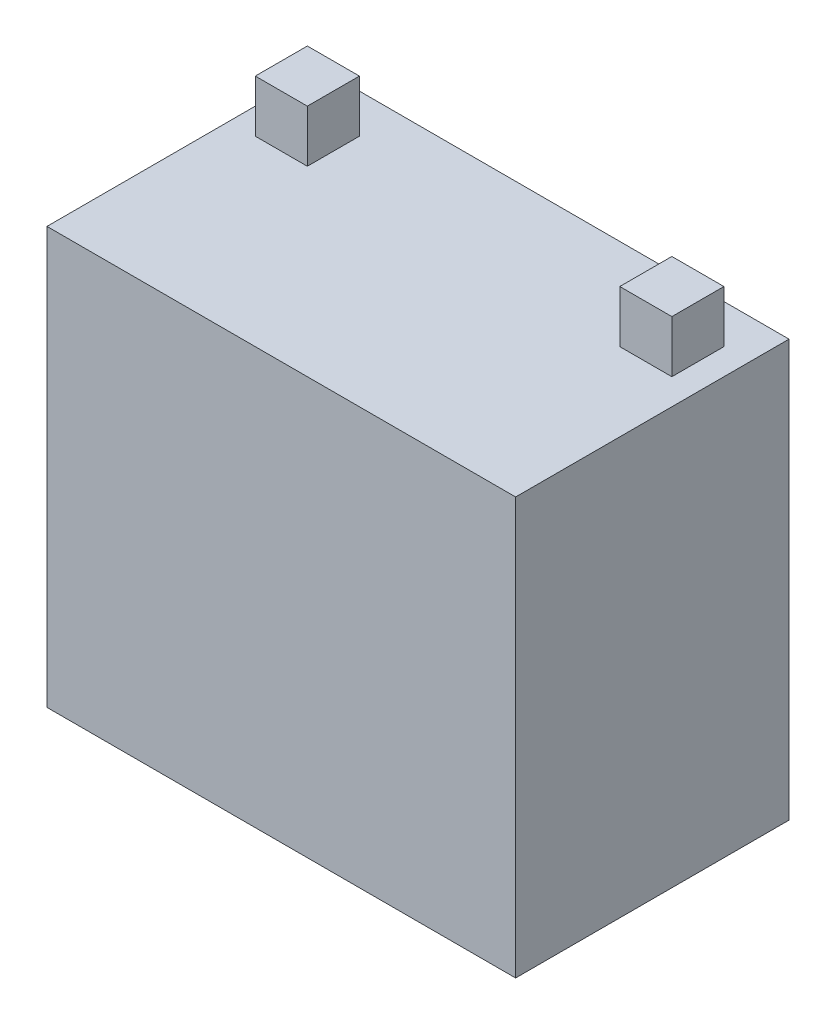
ISO-10303-21;
HEADER;
FILE_DESCRIPTION(('STEP AP214'),'2;1');
FILE_NAME('part.step','',(''),(''),'','','');
FILE_SCHEMA(('AUTOMOTIVE_DESIGN { 1 0 10303 214 1 1 1 1 }'));
ENDSEC;
DATA;
#1=APPLICATION_CONTEXT('core data for automotive mechanical design processes');
#2=APPLICATION_PROTOCOL_DEFINITION('international standard','automotive_design',2000,#1);
#3=PRODUCT_CONTEXT('',#1,'mechanical');
#4=PRODUCT('Part','Part','',(#3));
#5=PRODUCT_RELATED_PRODUCT_CATEGORY('part','',(#4));
#6=PRODUCT_DEFINITION_FORMATION('','',#4);
#7=PRODUCT_DEFINITION_CONTEXT('part definition',#1,'design');
#8=PRODUCT_DEFINITION('design','',#6,#7);
#9=PRODUCT_DEFINITION_SHAPE('','',#8);
#10=(LENGTH_UNIT() NAMED_UNIT(*) SI_UNIT(.MILLI.,.METRE.));
#11=(NAMED_UNIT(*) PLANE_ANGLE_UNIT() SI_UNIT($,.RADIAN.));
#12=(NAMED_UNIT(*) SI_UNIT($,.STERADIAN.) SOLID_ANGLE_UNIT());
#13=UNCERTAINTY_MEASURE_WITH_UNIT(LENGTH_MEASURE(1.E-05),#10,'distance_accuracy_value','');
#14=(GEOMETRIC_REPRESENTATION_CONTEXT(3) GLOBAL_UNCERTAINTY_ASSIGNED_CONTEXT((#13)) GLOBAL_UNIT_ASSIGNED_CONTEXT((#10,
#11,#12)) REPRESENTATION_CONTEXT('',''));
#15=CARTESIAN_POINT('',(0.,0.,0.));
#16=DIRECTION('',(0.,0.,1.));
#17=DIRECTION('',(1.,0.,0.));
#18=AXIS2_PLACEMENT_3D('',#15,#16,#17);
#19=CARTESIAN_POINT('',(0.,101.6,0.));
#20=DIRECTION('',(0.,-1.,0.));
#21=DIRECTION('',(0.,0.,-1.));
#22=AXIS2_PLACEMENT_3D('',#19,#20,#21);
#23=PLANE('',#22);
#24=DIRECTION('',(0.,0.,-1.));
#25=VECTOR('',#24,1.);
#26=CARTESIAN_POINT('',(-76.2,101.6,-47.625));
#27=LINE('',#26,#25);
#28=CARTESIAN_POINT('',(-76.2,101.6,-22.225));
#29=VERTEX_POINT('',#28);
#30=CARTESIAN_POINT('',(-76.2,101.6,-47.625));
#31=VERTEX_POINT('',#30);
#32=EDGE_CURVE('E145',#29,#31,#27,.T.);
#33=ORIENTED_EDGE('',*,*,#32,.F.);
#34=DIRECTION('',(1.,0.,0.));
#35=VECTOR('',#34,1.);
#36=CARTESIAN_POINT('',(-101.6,101.6,-22.225));
#37=LINE('',#36,#35);
#38=CARTESIAN_POINT('',(-101.6,101.6,-22.225));
#39=VERTEX_POINT('',#38);
#40=EDGE_CURVE('E158',#39,#29,#37,.T.);
#41=ORIENTED_EDGE('',*,*,#40,.F.);
#42=DIRECTION('',(0.,0.,1.));
#43=VECTOR('',#42,1.);
#44=CARTESIAN_POINT('',(-101.6,101.6,-47.625));
#45=LINE('',#44,#43);
#46=CARTESIAN_POINT('',(-101.6,101.6,-47.625));
#47=VERTEX_POINT('',#46);
#48=EDGE_CURVE('E167',#47,#39,#45,.T.);
#49=ORIENTED_EDGE('',*,*,#48,.F.);
#50=DIRECTION('',(-1.,0.,0.));
#51=VECTOR('',#50,1.);
#52=CARTESIAN_POINT('',(-101.6,101.6,-47.625));
#53=LINE('',#52,#51);
#54=EDGE_CURVE('E148',#31,#47,#53,.T.);
#55=ORIENTED_EDGE('',*,*,#54,.F.);
#56=EDGE_LOOP('',(#33,#41,#49,#55));
#57=FACE_BOUND('',#56,.T.);
#58=DIRECTION('',(0.,0.,-1.));
#59=VECTOR('',#58,1.);
#60=CARTESIAN_POINT('',(114.3,101.6,66.675));
#61=LINE('',#60,#59);
#62=CARTESIAN_POINT('',(114.3,101.6,66.675));
#63=VERTEX_POINT('',#62);
#64=CARTESIAN_POINT('',(114.3,101.6,-66.675));
#65=VERTEX_POINT('',#64);
#66=EDGE_CURVE('E184',#63,#65,#61,.T.);
#67=ORIENTED_EDGE('',*,*,#66,.T.);
#68=DIRECTION('',(-1.,0.,0.));
#69=VECTOR('',#68,1.);
#70=CARTESIAN_POINT('',(-114.3,101.6,-66.675));
#71=LINE('',#70,#69);
#72=CARTESIAN_POINT('',(-114.3,101.6,-66.675));
#73=VERTEX_POINT('',#72);
#74=EDGE_CURVE('E187',#65,#73,#71,.T.);
#75=ORIENTED_EDGE('',*,*,#74,.T.);
#76=DIRECTION('',(0.,0.,1.));
#77=VECTOR('',#76,1.);
#78=CARTESIAN_POINT('',(-114.3,101.6,66.675));
#79=LINE('',#78,#77);
#80=CARTESIAN_POINT('',(-114.3,101.6,66.675));
#81=VERTEX_POINT('',#80);
#82=EDGE_CURVE('E190',#73,#81,#79,.T.);
#83=ORIENTED_EDGE('',*,*,#82,.T.);
#84=DIRECTION('',(1.,0.,0.));
#85=VECTOR('',#84,1.);
#86=CARTESIAN_POINT('',(-114.3,101.6,66.675));
#87=LINE('',#86,#85);
#88=EDGE_CURVE('E192',#81,#63,#87,.T.);
#89=ORIENTED_EDGE('',*,*,#88,.T.);
#90=EDGE_LOOP('',(#67,#75,#83,#89));
#91=FACE_BOUND('',#90,.T.);
#92=DIRECTION('',(0.,0.,-1.));
#93=VECTOR('',#92,1.);
#94=CARTESIAN_POINT('',(101.6,101.6,-22.225));
#95=LINE('',#94,#93);
#96=CARTESIAN_POINT('',(101.6,101.6,-22.225));
#97=VERTEX_POINT('',#96);
#98=CARTESIAN_POINT('',(101.6,101.6,-47.625));
#99=VERTEX_POINT('',#98);
#100=EDGE_CURVE('E144',#97,#99,#95,.T.);
#101=ORIENTED_EDGE('',*,*,#100,.F.);
#102=DIRECTION('',(1.,0.,0.));
#103=VECTOR('',#102,1.);
#104=CARTESIAN_POINT('',(76.2,101.6,-22.225));
#105=LINE('',#104,#103);
#106=CARTESIAN_POINT('',(76.2,101.6,-22.225));
#107=VERTEX_POINT('',#106);
#108=EDGE_CURVE('E141',#107,#97,#105,.T.);
#109=ORIENTED_EDGE('',*,*,#108,.F.);
#110=DIRECTION('',(0.,0.,1.));
#111=VECTOR('',#110,1.);
#112=CARTESIAN_POINT('',(76.2,101.6,-22.225));
#113=LINE('',#112,#111);
#114=CARTESIAN_POINT('',(76.2,101.6,-47.625));
#115=VERTEX_POINT('',#114);
#116=EDGE_CURVE('E55',#115,#107,#113,.T.);
#117=ORIENTED_EDGE('',*,*,#116,.F.);
#118=DIRECTION('',(-1.,0.,0.));
#119=VECTOR('',#118,1.);
#120=CARTESIAN_POINT('',(76.2,101.6,-47.625));
#121=LINE('',#120,#119);
#122=EDGE_CURVE('E50',#99,#115,#121,.T.);
#123=ORIENTED_EDGE('',*,*,#122,.F.);
#124=EDGE_LOOP('',(#101,#109,#117,#123));
#125=FACE_BOUND('',#124,.T.);
#126=ADVANCED_FACE('F35',(#57,#91,#125),#23,.F.);
#127=CARTESIAN_POINT('',(114.3,101.6,66.675));
#128=DIRECTION('',(-1.,0.,0.));
#129=DIRECTION('',(0.,0.,1.));
#130=AXIS2_PLACEMENT_3D('',#127,#128,#129);
#131=PLANE('',#130);
#132=DIRECTION('',(0.,0.,-1.));
#133=VECTOR('',#132,1.);
#134=CARTESIAN_POINT('',(114.3,-101.6,66.675));
#135=LINE('',#134,#133);
#136=CARTESIAN_POINT('',(114.3,-101.6,66.675));
#137=VERTEX_POINT('',#136);
#138=CARTESIAN_POINT('',(114.3,-101.6,-66.675));
#139=VERTEX_POINT('',#138);
#140=EDGE_CURVE('E183',#137,#139,#135,.T.);
#141=ORIENTED_EDGE('',*,*,#140,.T.);
#142=DIRECTION('',(0.,-1.,0.));
#143=VECTOR('',#142,1.);
#144=CARTESIAN_POINT('',(114.3,101.6,-66.675));
#145=LINE('',#144,#143);
#146=EDGE_CURVE('E11',#65,#139,#145,.T.);
#147=ORIENTED_EDGE('',*,*,#146,.F.);
#148=ORIENTED_EDGE('',*,*,#66,.F.);
#149=DIRECTION('',(0.,-1.,0.));
#150=VECTOR('',#149,1.);
#151=CARTESIAN_POINT('',(114.3,101.6,66.675));
#152=LINE('',#151,#150);
#153=EDGE_CURVE('E194',#63,#137,#152,.T.);
#154=ORIENTED_EDGE('',*,*,#153,.T.);
#155=EDGE_LOOP('',(#141,#147,#148,#154));
#156=FACE_BOUND('',#155,.T.);
#157=ADVANCED_FACE('F37',(#156),#131,.F.);
#158=CARTESIAN_POINT('',(-114.3,101.6,-66.675));
#159=DIRECTION('',(0.,0.,1.));
#160=DIRECTION('',(1.,0.,0.));
#161=AXIS2_PLACEMENT_3D('',#158,#159,#160);
#162=PLANE('',#161);
#163=DIRECTION('',(-1.,0.,0.));
#164=VECTOR('',#163,1.);
#165=CARTESIAN_POINT('',(-114.3,-101.6,-66.675));
#166=LINE('',#165,#164);
#167=CARTESIAN_POINT('',(-114.3,-101.6,-66.675));
#168=VERTEX_POINT('',#167);
#169=EDGE_CURVE('E197',#139,#168,#166,.T.);
#170=ORIENTED_EDGE('',*,*,#169,.T.);
#171=DIRECTION('',(0.,-1.,0.));
#172=VECTOR('',#171,1.);
#173=CARTESIAN_POINT('',(-114.3,101.6,-66.675));
#174=LINE('',#173,#172);
#175=EDGE_CURVE('E43',#73,#168,#174,.T.);
#176=ORIENTED_EDGE('',*,*,#175,.F.);
#177=ORIENTED_EDGE('',*,*,#74,.F.);
#178=ORIENTED_EDGE('',*,*,#146,.T.);
#179=EDGE_LOOP('',(#170,#176,#177,#178));
#180=FACE_BOUND('',#179,.T.);
#181=ADVANCED_FACE('F226',(#180),#162,.F.);
#182=CARTESIAN_POINT('',(-114.3,101.6,66.675));
#183=DIRECTION('',(1.,0.,0.));
#184=DIRECTION('',(0.,0.,-1.));
#185=AXIS2_PLACEMENT_3D('',#182,#183,#184);
#186=PLANE('',#185);
#187=DIRECTION('',(0.,0.,1.));
#188=VECTOR('',#187,1.);
#189=CARTESIAN_POINT('',(-114.3,-101.6,66.675));
#190=LINE('',#189,#188);
#191=CARTESIAN_POINT('',(-114.3,-101.6,66.675));
#192=VERTEX_POINT('',#191);
#193=EDGE_CURVE('E199',#168,#192,#190,.T.);
#194=ORIENTED_EDGE('',*,*,#193,.T.);
#195=DIRECTION('',(0.,-1.,0.));
#196=VECTOR('',#195,1.);
#197=CARTESIAN_POINT('',(-114.3,101.6,66.675));
#198=LINE('',#197,#196);
#199=EDGE_CURVE('E204',#81,#192,#198,.T.);
#200=ORIENTED_EDGE('',*,*,#199,.F.);
#201=ORIENTED_EDGE('',*,*,#82,.F.);
#202=ORIENTED_EDGE('',*,*,#175,.T.);
#203=EDGE_LOOP('',(#194,#200,#201,#202));
#204=FACE_BOUND('',#203,.T.);
#205=ADVANCED_FACE('F211',(#204),#186,.F.);
#206=CARTESIAN_POINT('',(-114.3,101.6,66.675));
#207=DIRECTION('',(0.,0.,-1.));
#208=DIRECTION('',(-1.,0.,0.));
#209=AXIS2_PLACEMENT_3D('',#206,#207,#208);
#210=PLANE('',#209);
#211=DIRECTION('',(1.,0.,0.));
#212=VECTOR('',#211,1.);
#213=CARTESIAN_POINT('',(-114.3,-101.6,66.675));
#214=LINE('',#213,#212);
#215=EDGE_CURVE('E188',#192,#137,#214,.T.);
#216=ORIENTED_EDGE('',*,*,#215,.T.);
#217=ORIENTED_EDGE('',*,*,#153,.F.);
#218=ORIENTED_EDGE('',*,*,#88,.F.);
#219=ORIENTED_EDGE('',*,*,#199,.T.);
#220=EDGE_LOOP('',(#216,#217,#218,#219));
#221=FACE_BOUND('',#220,.T.);
#222=ADVANCED_FACE('F220',(#221),#210,.F.);
#223=CARTESIAN_POINT('',(0.,-101.6,0.));
#224=DIRECTION('',(0.,-1.,0.));
#225=DIRECTION('',(0.,0.,-1.));
#226=AXIS2_PLACEMENT_3D('',#223,#224,#225);
#227=PLANE('',#226);
#228=ORIENTED_EDGE('',*,*,#140,.F.);
#229=ORIENTED_EDGE('',*,*,#215,.F.);
#230=ORIENTED_EDGE('',*,*,#193,.F.);
#231=ORIENTED_EDGE('',*,*,#169,.F.);
#232=EDGE_LOOP('',(#228,#229,#230,#231));
#233=FACE_BOUND('',#232,.T.);
#234=ADVANCED_FACE('F217',(#233),#227,.T.);
#235=CARTESIAN_POINT('',(-76.2,127.,-47.625));
#236=DIRECTION('',(-1.,0.,0.));
#237=DIRECTION('',(0.,0.,1.));
#238=AXIS2_PLACEMENT_3D('',#235,#236,#237);
#239=PLANE('',#238);
#240=ORIENTED_EDGE('',*,*,#32,.T.);
#241=DIRECTION('',(0.,-1.,0.));
#242=VECTOR('',#241,1.);
#243=CARTESIAN_POINT('',(-76.2,127.,-47.625));
#244=LINE('',#243,#242);
#245=CARTESIAN_POINT('',(-76.2,127.,-47.625));
#246=VERTEX_POINT('',#245);
#247=EDGE_CURVE('E180',#246,#31,#244,.T.);
#248=ORIENTED_EDGE('',*,*,#247,.F.);
#249=DIRECTION('',(0.,0.,-1.));
#250=VECTOR('',#249,1.);
#251=CARTESIAN_POINT('',(-76.2,127.,-47.625));
#252=LINE('',#251,#250);
#253=CARTESIAN_POINT('',(-76.2,127.,-22.225));
#254=VERTEX_POINT('',#253);
#255=EDGE_CURVE('E154',#254,#246,#252,.T.);
#256=ORIENTED_EDGE('',*,*,#255,.F.);
#257=DIRECTION('',(0.,-1.,0.));
#258=VECTOR('',#257,1.);
#259=CARTESIAN_POINT('',(-76.2,127.,-22.225));
#260=LINE('',#259,#258);
#261=EDGE_CURVE('E163',#254,#29,#260,.T.);
#262=ORIENTED_EDGE('',*,*,#261,.T.);
#263=EDGE_LOOP('',(#240,#248,#256,#262));
#264=FACE_BOUND('',#263,.T.);
#265=ADVANCED_FACE('F240',(#264),#239,.F.);
#266=CARTESIAN_POINT('',(-101.6,127.,-47.625));
#267=DIRECTION('',(0.,0.,1.));
#268=DIRECTION('',(1.,0.,0.));
#269=AXIS2_PLACEMENT_3D('',#266,#267,#268);
#270=PLANE('',#269);
#271=ORIENTED_EDGE('',*,*,#54,.T.);
#272=DIRECTION('',(0.,-1.,0.));
#273=VECTOR('',#272,1.);
#274=CARTESIAN_POINT('',(-101.6,127.,-47.625));
#275=LINE('',#274,#273);
#276=CARTESIAN_POINT('',(-101.6,127.,-47.625));
#277=VERTEX_POINT('',#276);
#278=EDGE_CURVE('E177',#277,#47,#275,.T.);
#279=ORIENTED_EDGE('',*,*,#278,.F.);
#280=DIRECTION('',(-1.,0.,0.));
#281=VECTOR('',#280,1.);
#282=CARTESIAN_POINT('',(-101.6,127.,-47.625));
#283=LINE('',#282,#281);
#284=EDGE_CURVE('E157',#246,#277,#283,.T.);
#285=ORIENTED_EDGE('',*,*,#284,.F.);
#286=ORIENTED_EDGE('',*,*,#247,.T.);
#287=EDGE_LOOP('',(#271,#279,#285,#286));
#288=FACE_BOUND('',#287,.T.);
#289=ADVANCED_FACE('F259',(#288),#270,.F.);
#290=CARTESIAN_POINT('',(-101.6,127.,-47.625));
#291=DIRECTION('',(1.,0.,0.));
#292=DIRECTION('',(0.,0.,-1.));
#293=AXIS2_PLACEMENT_3D('',#290,#291,#292);
#294=PLANE('',#293);
#295=ORIENTED_EDGE('',*,*,#48,.T.);
#296=DIRECTION('',(0.,-1.,0.));
#297=VECTOR('',#296,1.);
#298=CARTESIAN_POINT('',(-101.6,127.,-22.225));
#299=LINE('',#298,#297);
#300=CARTESIAN_POINT('',(-101.6,127.,-22.225));
#301=VERTEX_POINT('',#300);
#302=EDGE_CURVE('E174',#301,#39,#299,.T.);
#303=ORIENTED_EDGE('',*,*,#302,.F.);
#304=DIRECTION('',(0.,0.,1.));
#305=VECTOR('',#304,1.);
#306=CARTESIAN_POINT('',(-101.6,127.,-47.625));
#307=LINE('',#306,#305);
#308=EDGE_CURVE('E160',#277,#301,#307,.T.);
#309=ORIENTED_EDGE('',*,*,#308,.F.);
#310=ORIENTED_EDGE('',*,*,#278,.T.);
#311=EDGE_LOOP('',(#295,#303,#309,#310));
#312=FACE_BOUND('',#311,.T.);
#313=ADVANCED_FACE('F268',(#312),#294,.F.);
#314=CARTESIAN_POINT('',(-101.6,127.,-22.225));
#315=DIRECTION('',(0.,0.,-1.));
#316=DIRECTION('',(-1.,0.,0.));
#317=AXIS2_PLACEMENT_3D('',#314,#315,#316);
#318=PLANE('',#317);
#319=ORIENTED_EDGE('',*,*,#40,.T.);
#320=ORIENTED_EDGE('',*,*,#261,.F.);
#321=DIRECTION('',(1.,0.,0.));
#322=VECTOR('',#321,1.);
#323=CARTESIAN_POINT('',(-101.6,127.,-22.225));
#324=LINE('',#323,#322);
#325=EDGE_CURVE('E162',#301,#254,#324,.T.);
#326=ORIENTED_EDGE('',*,*,#325,.F.);
#327=ORIENTED_EDGE('',*,*,#302,.T.);
#328=EDGE_LOOP('',(#319,#320,#326,#327));
#329=FACE_BOUND('',#328,.T.);
#330=ADVANCED_FACE('F276',(#329),#318,.F.);
#331=CARTESIAN_POINT('',(0.,127.,0.));
#332=DIRECTION('',(0.,1.,0.));
#333=DIRECTION('',(0.,0.,1.));
#334=AXIS2_PLACEMENT_3D('',#331,#332,#333);
#335=PLANE('',#334);
#336=ORIENTED_EDGE('',*,*,#255,.T.);
#337=ORIENTED_EDGE('',*,*,#284,.T.);
#338=ORIENTED_EDGE('',*,*,#308,.T.);
#339=ORIENTED_EDGE('',*,*,#325,.T.);
#340=EDGE_LOOP('',(#336,#337,#338,#339));
#341=FACE_BOUND('',#340,.T.);
#342=ADVANCED_FACE('F283',(#341),#335,.T.);
#343=CARTESIAN_POINT('',(101.6,127.,-22.225));
#344=DIRECTION('',(-1.,0.,0.));
#345=DIRECTION('',(0.,0.,1.));
#346=AXIS2_PLACEMENT_3D('',#343,#344,#345);
#347=PLANE('',#346);
#348=ORIENTED_EDGE('',*,*,#100,.T.);
#349=DIRECTION('',(0.,-1.,0.));
#350=VECTOR('',#349,1.);
#351=CARTESIAN_POINT('',(101.6,127.,-47.625));
#352=LINE('',#351,#350);
#353=CARTESIAN_POINT('',(101.6,127.,-47.625));
#354=VERTEX_POINT('',#353);
#355=EDGE_CURVE('E125',#354,#99,#352,.T.);
#356=ORIENTED_EDGE('',*,*,#355,.F.);
#357=DIRECTION('',(0.,0.,-1.));
#358=VECTOR('',#357,1.);
#359=CARTESIAN_POINT('',(101.6,127.,-22.225));
#360=LINE('',#359,#358);
#361=CARTESIAN_POINT('',(101.6,127.,-22.225));
#362=VERTEX_POINT('',#361);
#363=EDGE_CURVE('E132',#362,#354,#360,.T.);
#364=ORIENTED_EDGE('',*,*,#363,.F.);
#365=DIRECTION('',(0.,-1.,0.));
#366=VECTOR('',#365,1.);
#367=CARTESIAN_POINT('',(101.6,127.,-22.225));
#368=LINE('',#367,#366);
#369=EDGE_CURVE('E390',#362,#97,#368,.T.);
#370=ORIENTED_EDGE('',*,*,#369,.T.);
#371=EDGE_LOOP('',(#348,#356,#364,#370));
#372=FACE_BOUND('',#371,.T.);
#373=ADVANCED_FACE('F143',(#372),#347,.F.);
#374=CARTESIAN_POINT('',(76.2,127.,-47.625));
#375=DIRECTION('',(0.,0.,1.));
#376=DIRECTION('',(1.,0.,0.));
#377=AXIS2_PLACEMENT_3D('',#374,#375,#376);
#378=PLANE('',#377);
#379=ORIENTED_EDGE('',*,*,#122,.T.);
#380=DIRECTION('',(0.,-1.,0.));
#381=VECTOR('',#380,1.);
#382=CARTESIAN_POINT('',(76.2,127.,-47.625));
#383=LINE('',#382,#381);
#384=CARTESIAN_POINT('',(76.2,127.,-47.625));
#385=VERTEX_POINT('',#384);
#386=EDGE_CURVE('E128',#385,#115,#383,.T.);
#387=ORIENTED_EDGE('',*,*,#386,.F.);
#388=DIRECTION('',(-1.,0.,0.));
#389=VECTOR('',#388,1.);
#390=CARTESIAN_POINT('',(76.2,127.,-47.625));
#391=LINE('',#390,#389);
#392=EDGE_CURVE('E121',#354,#385,#391,.T.);
#393=ORIENTED_EDGE('',*,*,#392,.F.);
#394=ORIENTED_EDGE('',*,*,#355,.T.);
#395=EDGE_LOOP('',(#379,#387,#393,#394));
#396=FACE_BOUND('',#395,.T.);
#397=ADVANCED_FACE('F123',(#396),#378,.F.);
#398=CARTESIAN_POINT('',(76.2,127.,-22.225));
#399=DIRECTION('',(1.,0.,0.));
#400=DIRECTION('',(0.,0.,-1.));
#401=AXIS2_PLACEMENT_3D('',#398,#399,#400);
#402=PLANE('',#401);
#403=ORIENTED_EDGE('',*,*,#116,.T.);
#404=DIRECTION('',(0.,-1.,0.));
#405=VECTOR('',#404,1.);
#406=CARTESIAN_POINT('',(76.2,127.,-22.225));
#407=LINE('',#406,#405);
#408=CARTESIAN_POINT('',(76.2,127.,-22.225));
#409=VERTEX_POINT('',#408);
#410=EDGE_CURVE('E150',#409,#107,#407,.T.);
#411=ORIENTED_EDGE('',*,*,#410,.F.);
#412=DIRECTION('',(0.,0.,1.));
#413=VECTOR('',#412,1.);
#414=CARTESIAN_POINT('',(76.2,127.,-22.225));
#415=LINE('',#414,#413);
#416=EDGE_CURVE('E131',#385,#409,#415,.T.);
#417=ORIENTED_EDGE('',*,*,#416,.F.);
#418=ORIENTED_EDGE('',*,*,#386,.T.);
#419=EDGE_LOOP('',(#403,#411,#417,#418));
#420=FACE_BOUND('',#419,.T.);
#421=ADVANCED_FACE('F305',(#420),#402,.F.);
#422=CARTESIAN_POINT('',(76.2,127.,-22.225));
#423=DIRECTION('',(0.,0.,-1.));
#424=DIRECTION('',(-1.,0.,0.));
#425=AXIS2_PLACEMENT_3D('',#422,#423,#424);
#426=PLANE('',#425);
#427=ORIENTED_EDGE('',*,*,#108,.T.);
#428=ORIENTED_EDGE('',*,*,#369,.F.);
#429=DIRECTION('',(1.,0.,0.));
#430=VECTOR('',#429,1.);
#431=CARTESIAN_POINT('',(76.2,127.,-22.225));
#432=LINE('',#431,#430);
#433=EDGE_CURVE('E137',#409,#362,#432,.T.);
#434=ORIENTED_EDGE('',*,*,#433,.F.);
#435=ORIENTED_EDGE('',*,*,#410,.T.);
#436=EDGE_LOOP('',(#427,#428,#434,#435));
#437=FACE_BOUND('',#436,.T.);
#438=ADVANCED_FACE('F311',(#437),#426,.F.);
#439=CARTESIAN_POINT('',(0.,127.,0.));
#440=DIRECTION('',(0.,-1.,0.));
#441=DIRECTION('',(0.,0.,-1.));
#442=AXIS2_PLACEMENT_3D('',#439,#440,#441);
#443=PLANE('',#442);
#444=ORIENTED_EDGE('',*,*,#363,.T.);
#445=ORIENTED_EDGE('',*,*,#392,.T.);
#446=ORIENTED_EDGE('',*,*,#416,.T.);
#447=ORIENTED_EDGE('',*,*,#433,.T.);
#448=EDGE_LOOP('',(#444,#445,#446,#447));
#449=FACE_BOUND('',#448,.T.);
#450=ADVANCED_FACE('F135',(#449),#443,.F.);
#451=CLOSED_SHELL('',(#126,#157,#181,#205,#222,#234,#265,#289,#313,#330,#342,#373,#397,#421,
#438,#450));
#452=MANIFOLD_SOLID_BREP('B2',#451);
#453=ADVANCED_BREP_SHAPE_REPRESENTATION('',(#18,#452),#14);
#454=SHAPE_DEFINITION_REPRESENTATION(#9,#453);
ENDSEC;
END-ISO-10303-21;
